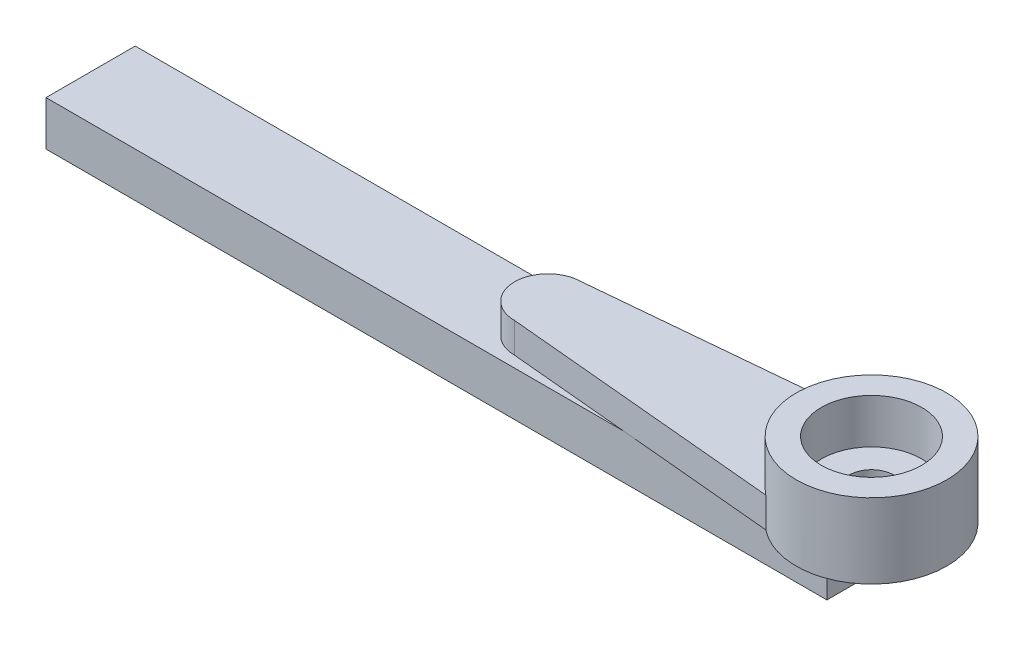
ISO-10303-21;
HEADER;
FILE_DESCRIPTION(('STEP AP214'),'2;1');
FILE_NAME('part.step','',(''),(''),'','','');
FILE_SCHEMA(('AUTOMOTIVE_DESIGN { 1 0 10303 214 1 1 1 1 }'));
ENDSEC;
DATA;
#1=APPLICATION_CONTEXT('core data for automotive mechanical design processes');
#2=APPLICATION_PROTOCOL_DEFINITION('international standard','automotive_design',2000,#1);
#3=PRODUCT_CONTEXT('',#1,'mechanical');
#4=PRODUCT('Part','Part','',(#3));
#5=PRODUCT_RELATED_PRODUCT_CATEGORY('part','',(#4));
#6=PRODUCT_DEFINITION_FORMATION('','',#4);
#7=PRODUCT_DEFINITION_CONTEXT('part definition',#1,'design');
#8=PRODUCT_DEFINITION('design','',#6,#7);
#9=PRODUCT_DEFINITION_SHAPE('','',#8);
#10=(LENGTH_UNIT() NAMED_UNIT(*) SI_UNIT(.MILLI.,.METRE.));
#11=(NAMED_UNIT(*) PLANE_ANGLE_UNIT() SI_UNIT($,.RADIAN.));
#12=(NAMED_UNIT(*) SI_UNIT($,.STERADIAN.) SOLID_ANGLE_UNIT());
#13=UNCERTAINTY_MEASURE_WITH_UNIT(LENGTH_MEASURE(1.E-05),#10,'distance_accuracy_value','');
#14=(GEOMETRIC_REPRESENTATION_CONTEXT(3) GLOBAL_UNCERTAINTY_ASSIGNED_CONTEXT((#13)) GLOBAL_UNIT_ASSIGNED_CONTEXT((#10,
#11,#12)) REPRESENTATION_CONTEXT('',''));
#15=CARTESIAN_POINT('',(0.,0.,0.));
#16=DIRECTION('',(0.,0.,1.));
#17=DIRECTION('',(1.,0.,0.));
#18=AXIS2_PLACEMENT_3D('',#15,#16,#17);
#19=CARTESIAN_POINT('',(0.,0.,0.));
#20=DIRECTION('',(0.,1.,0.));
#21=DIRECTION('',(0.,0.,1.));
#22=AXIS2_PLACEMENT_3D('',#19,#20,#21);
#23=PLANE('',#22);
#24=DIRECTION('',(0.,0.,1.));
#25=VECTOR('',#24,1.);
#26=CARTESIAN_POINT('',(0.,0.,-1.99999999999999));
#27=LINE('',#26,#25);
#28=CARTESIAN_POINT('',(0.,0.,-1.99999999999999));
#29=VERTEX_POINT('',#28);
#30=CARTESIAN_POINT('',(0.,0.,-1.));
#31=VERTEX_POINT('',#30);
#32=EDGE_CURVE('E57',#29,#31,#27,.T.);
#33=ORIENTED_EDGE('',*,*,#32,.F.);
#34=DIRECTION('',(1.,0.,0.));
#35=VECTOR('',#34,1.);
#36=CARTESIAN_POINT('',(0.,0.,-1.99999999999999));
#37=LINE('',#36,#35);
#38=CARTESIAN_POINT('',(-9.10435042645774,0.,-2.));
#39=VERTEX_POINT('',#38);
#40=EDGE_CURVE('E11',#39,#29,#37,.T.);
#41=ORIENTED_EDGE('',*,*,#40,.F.);
#42=DIRECTION('',(-0.995733846741475,0.,0.0922719158434676));
#43=VECTOR('',#42,1.);
#44=CARTESIAN_POINT('',(-0.26127194813818,0.,-2.81946375110068));
#45=LINE('',#44,#43);
#46=CARTESIAN_POINT('',(-2.09000598085269,0.,-2.65));
#47=VERTEX_POINT('',#46);
#48=EDGE_CURVE('E174',#47,#39,#45,.T.);
#49=ORIENTED_EDGE('',*,*,#48,.F.);
#50=CARTESIAN_POINT('',(0.,0.,0.));
#51=DIRECTION('',(0.,1.,0.));
#52=DIRECTION('',(0.,0.,1.));
#53=AXIS2_PLACEMENT_3D('',#50,#51,#52);
#54=CIRCLE('',#53,3.375);
#55=CARTESIAN_POINT('',(-2.09000598085269,0.,2.65));
#56=VERTEX_POINT('',#55);
#57=EDGE_CURVE('E168',#56,#47,#54,.T.);
#58=ORIENTED_EDGE('',*,*,#57,.F.);
#59=DIRECTION('',(-0.995733846741475,0.,-0.0922719158434676));
#60=VECTOR('',#59,1.);
#61=CARTESIAN_POINT('',(-0.26127194813818,0.,2.81946375110068));
#62=LINE('',#61,#60);
#63=CARTESIAN_POINT('',(-9.10435042645774,0.,2.));
#64=VERTEX_POINT('',#63);
#65=EDGE_CURVE('E181',#56,#64,#62,.T.);
#66=ORIENTED_EDGE('',*,*,#65,.T.);
#67=DIRECTION('',(-1.,0.,0.));
#68=VECTOR('',#67,1.);
#69=CARTESIAN_POINT('',(0.,0.,1.99999999999999));
#70=LINE('',#69,#68);
#71=CARTESIAN_POINT('',(0.,0.,1.99999999999999));
#72=VERTEX_POINT('',#71);
#73=EDGE_CURVE('E63',#72,#64,#70,.T.);
#74=ORIENTED_EDGE('',*,*,#73,.F.);
#75=CARTESIAN_POINT('',(0.,0.,1.));
#76=VERTEX_POINT('',#75);
#77=EDGE_CURVE('E48',#76,#72,#27,.T.);
#78=ORIENTED_EDGE('',*,*,#77,.F.);
#79=CARTESIAN_POINT('',(0.,0.,0.));
#80=DIRECTION('',(0.,1.,0.));
#81=DIRECTION('',(0.,0.,1.));
#82=AXIS2_PLACEMENT_3D('',#79,#80,#81);
#83=CIRCLE('',#82,1.);
#84=EDGE_CURVE('E149',#76,#31,#83,.T.);
#85=ORIENTED_EDGE('',*,*,#84,.T.);
#86=EDGE_LOOP('',(#33,#41,#49,#58,#66,#74,#78,#85));
#87=FACE_BOUND('',#86,.T.);
#88=ADVANCED_FACE('F39',(#87),#23,.F.);
#89=CARTESIAN_POINT('',(-0.26127194813818,1.35,-2.81946375110068));
#90=DIRECTION('',(0.0922719158434675,0.,0.995733846741475));
#91=DIRECTION('',(0.995733846741475,0.,-0.0922719158434676));
#92=AXIS2_PLACEMENT_3D('',#89,#90,#91);
#93=PLANE('',#92);
#94=ORIENTED_EDGE('',*,*,#48,.T.);
#95=CARTESIAN_POINT('',(-14.5,0.,-1.5));
#96=VERTEX_POINT('',#95);
#97=EDGE_CURVE('E161',#39,#96,#45,.T.);
#98=ORIENTED_EDGE('',*,*,#97,.T.);
#99=DIRECTION('',(0.,-1.,0.));
#100=VECTOR('',#99,1.);
#101=CARTESIAN_POINT('',(-14.5,1.35,-1.5));
#102=LINE('',#101,#100);
#103=CARTESIAN_POINT('',(-14.5,1.35,-1.5));
#104=VERTEX_POINT('',#103);
#105=EDGE_CURVE('E43',#104,#96,#102,.T.);
#106=ORIENTED_EDGE('',*,*,#105,.F.);
#107=DIRECTION('',(-0.995733846741475,0.,0.0922719158434676));
#108=VECTOR('',#107,1.);
#109=CARTESIAN_POINT('',(-0.26127194813818,1.35,-2.81946375110068));
#110=LINE('',#109,#108);
#111=CARTESIAN_POINT('',(-2.09000598085269,1.35,-2.65));
#112=VERTEX_POINT('',#111);
#113=EDGE_CURVE('E164',#112,#104,#110,.T.);
#114=ORIENTED_EDGE('',*,*,#113,.F.);
#115=DIRECTION('',(0.,-1.,0.));
#116=VECTOR('',#115,1.);
#117=CARTESIAN_POINT('',(-2.09000598085269,1.35,-2.65));
#118=LINE('',#117,#116);
#119=EDGE_CURVE('E173',#112,#47,#118,.T.);
#120=ORIENTED_EDGE('',*,*,#119,.T.);
#121=EDGE_LOOP('',(#94,#98,#106,#114,#120));
#122=FACE_BOUND('',#121,.T.);
#123=ADVANCED_FACE('F41',(#122),#93,.F.);
#124=CARTESIAN_POINT('',(-14.5,1.35,0.));
#125=DIRECTION('',(0.,-1.,0.));
#126=DIRECTION('',(0.,0.,-1.));
#127=AXIS2_PLACEMENT_3D('',#124,#125,#126);
#128=CYLINDRICAL_SURFACE('',#127,1.5);
#129=CARTESIAN_POINT('',(-14.5,0.,0.));
#130=DIRECTION('',(0.,1.,0.));
#131=DIRECTION('',(0.,0.,1.));
#132=AXIS2_PLACEMENT_3D('',#129,#130,#131);
#133=CIRCLE('',#132,1.5);
#134=CARTESIAN_POINT('',(-14.5,0.,1.5));
#135=VERTEX_POINT('',#134);
#136=EDGE_CURVE('E177',#96,#135,#133,.T.);
#137=ORIENTED_EDGE('',*,*,#136,.T.);
#138=DIRECTION('',(0.,-1.,0.));
#139=VECTOR('',#138,1.);
#140=CARTESIAN_POINT('',(-14.5,1.35,1.5));
#141=LINE('',#140,#139);
#142=CARTESIAN_POINT('',(-14.5,1.35,1.5));
#143=VERTEX_POINT('',#142);
#144=EDGE_CURVE('E187',#143,#135,#141,.T.);
#145=ORIENTED_EDGE('',*,*,#144,.F.);
#146=CARTESIAN_POINT('',(-14.5,1.35,0.));
#147=DIRECTION('',(0.,1.,0.));
#148=DIRECTION('',(0.,0.,1.));
#149=AXIS2_PLACEMENT_3D('',#146,#147,#148);
#150=CIRCLE('',#149,1.5);
#151=EDGE_CURVE('E167',#104,#143,#150,.T.);
#152=ORIENTED_EDGE('',*,*,#151,.F.);
#153=ORIENTED_EDGE('',*,*,#105,.T.);
#154=EDGE_LOOP('',(#137,#145,#152,#153));
#155=FACE_BOUND('',#154,.T.);
#156=ADVANCED_FACE('F214',(#155),#128,.T.);
#157=CARTESIAN_POINT('',(-0.26127194813818,1.35,2.81946375110068));
#158=DIRECTION('',(-0.0922719158434675,0.,0.995733846741475));
#159=DIRECTION('',(0.995733846741475,0.,0.0922719158434676));
#160=AXIS2_PLACEMENT_3D('',#157,#158,#159);
#161=PLANE('',#160);
#162=ORIENTED_EDGE('',*,*,#65,.F.);
#163=DIRECTION('',(0.,-1.,0.));
#164=VECTOR('',#163,1.);
#165=CARTESIAN_POINT('',(-2.09000598085269,1.35,2.65));
#166=LINE('',#165,#164);
#167=CARTESIAN_POINT('',(-2.09000598085269,1.35,2.65));
#168=VERTEX_POINT('',#167);
#169=EDGE_CURVE('E186',#168,#56,#166,.T.);
#170=ORIENTED_EDGE('',*,*,#169,.F.);
#171=DIRECTION('',(-0.995733846741475,0.,-0.0922719158434676));
#172=VECTOR('',#171,1.);
#173=CARTESIAN_POINT('',(-0.26127194813818,1.35,2.81946375110068));
#174=LINE('',#173,#172);
#175=EDGE_CURVE('E170',#168,#143,#174,.T.);
#176=ORIENTED_EDGE('',*,*,#175,.T.);
#177=ORIENTED_EDGE('',*,*,#144,.T.);
#178=EDGE_CURVE('E180',#64,#135,#62,.T.);
#179=ORIENTED_EDGE('',*,*,#178,.F.);
#180=EDGE_LOOP('',(#162,#170,#176,#177,#179));
#181=FACE_BOUND('',#180,.T.);
#182=ADVANCED_FACE('F223',(#181),#161,.T.);
#183=CARTESIAN_POINT('',(0.,1.35,0.));
#184=DIRECTION('',(0.,-1.,0.));
#185=DIRECTION('',(0.,0.,-1.));
#186=AXIS2_PLACEMENT_3D('',#183,#184,#185);
#187=CYLINDRICAL_SURFACE('',#186,3.375);
#188=ORIENTED_EDGE('',*,*,#57,.T.);
#189=ORIENTED_EDGE('',*,*,#119,.F.);
#190=CARTESIAN_POINT('',(0.,1.35,0.));
#191=DIRECTION('',(0.,1.,0.));
#192=DIRECTION('',(0.,0.,1.));
#193=AXIS2_PLACEMENT_3D('',#190,#191,#192);
#194=CIRCLE('',#193,3.375);
#195=EDGE_CURVE('E155',#112,#168,#194,.T.);
#196=ORIENTED_EDGE('',*,*,#195,.T.);
#197=ORIENTED_EDGE('',*,*,#169,.T.);
#198=EDGE_LOOP('',(#188,#189,#196,#197));
#199=FACE_BOUND('',#198,.T.);
#200=CARTESIAN_POINT('',(0.,3.35,0.));
#201=DIRECTION('',(0.,1.,0.));
#202=DIRECTION('',(0.,0.,1.));
#203=AXIS2_PLACEMENT_3D('',#200,#201,#202);
#204=CIRCLE('',#203,3.375);
#205=CARTESIAN_POINT('',(0.,3.35,3.375));
#206=VERTEX_POINT('',#205);
#207=EDGE_CURVE('E158',#206,#206,#204,.T.);
#208=ORIENTED_EDGE('',*,*,#207,.F.);
#209=EDGE_LOOP('',(#208));
#210=FACE_BOUND('',#209,.T.);
#211=ADVANCED_FACE('F220',(#199,#210),#187,.T.);
#212=CARTESIAN_POINT('',(0.,1.35,0.));
#213=DIRECTION('',(0.,1.,0.));
#214=DIRECTION('',(0.,0.,1.));
#215=AXIS2_PLACEMENT_3D('',#212,#213,#214);
#216=PLANE('',#215);
#217=ORIENTED_EDGE('',*,*,#195,.F.);
#218=ORIENTED_EDGE('',*,*,#113,.T.);
#219=ORIENTED_EDGE('',*,*,#151,.T.);
#220=ORIENTED_EDGE('',*,*,#175,.F.);
#221=EDGE_LOOP('',(#217,#218,#219,#220));
#222=FACE_BOUND('',#221,.T.);
#223=ADVANCED_FACE('F218',(#222),#216,.T.);
#224=CARTESIAN_POINT('',(0.,3.35,0.));
#225=DIRECTION('',(0.,1.,0.));
#226=DIRECTION('',(0.,0.,1.));
#227=AXIS2_PLACEMENT_3D('',#224,#225,#226);
#228=PLANE('',#227);
#229=CARTESIAN_POINT('',(0.,3.35,0.));
#230=DIRECTION('',(0.,1.,0.));
#231=DIRECTION('',(0.,0.,1.));
#232=AXIS2_PLACEMENT_3D('',#229,#230,#231);
#233=CIRCLE('',#232,2.25);
#234=CARTESIAN_POINT('',(0.,3.35,2.25));
#235=VERTEX_POINT('',#234);
#236=EDGE_CURVE('E150',#235,#235,#233,.T.);
#237=ORIENTED_EDGE('',*,*,#236,.F.);
#238=EDGE_LOOP('',(#237));
#239=FACE_BOUND('',#238,.T.);
#240=ORIENTED_EDGE('',*,*,#207,.T.);
#241=EDGE_LOOP('',(#240));
#242=FACE_BOUND('',#241,.T.);
#243=ADVANCED_FACE('F244',(#239,#242),#228,.T.);
#244=CARTESIAN_POINT('',(0.,1.35,0.));
#245=DIRECTION('',(0.,1.,0.));
#246=DIRECTION('',(0.,0.,1.));
#247=AXIS2_PLACEMENT_3D('',#244,#245,#246);
#248=CYLINDRICAL_SURFACE('',#247,2.25);
#249=CARTESIAN_POINT('',(0.,1.35,0.));
#250=DIRECTION('',(0.,1.,0.));
#251=DIRECTION('',(0.,0.,1.));
#252=AXIS2_PLACEMENT_3D('',#249,#250,#251);
#253=CIRCLE('',#252,2.25);
#254=CARTESIAN_POINT('',(0.,1.35,2.25));
#255=VERTEX_POINT('',#254);
#256=EDGE_CURVE('E152',#255,#255,#253,.T.);
#257=ORIENTED_EDGE('',*,*,#256,.F.);
#258=EDGE_LOOP('',(#257));
#259=FACE_BOUND('',#258,.T.);
#260=ORIENTED_EDGE('',*,*,#236,.T.);
#261=EDGE_LOOP('',(#260));
#262=FACE_BOUND('',#261,.T.);
#263=ADVANCED_FACE('F248',(#259,#262),#248,.F.);
#264=CARTESIAN_POINT('',(0.,1.35,0.));
#265=DIRECTION('',(0.,1.,0.));
#266=DIRECTION('',(0.,0.,1.));
#267=AXIS2_PLACEMENT_3D('',#264,#265,#266);
#268=PLANE('',#267);
#269=CARTESIAN_POINT('',(0.,1.35,0.));
#270=DIRECTION('',(0.,1.,0.));
#271=DIRECTION('',(0.,0.,1.));
#272=AXIS2_PLACEMENT_3D('',#269,#270,#271);
#273=CIRCLE('',#272,1.);
#274=CARTESIAN_POINT('',(0.,1.35,1.));
#275=VERTEX_POINT('',#274);
#276=EDGE_CURVE('E140',#275,#275,#273,.T.);
#277=ORIENTED_EDGE('',*,*,#276,.F.);
#278=EDGE_LOOP('',(#277));
#279=FACE_BOUND('',#278,.T.);
#280=ORIENTED_EDGE('',*,*,#256,.T.);
#281=EDGE_LOOP('',(#280));
#282=FACE_BOUND('',#281,.T.);
#283=ADVANCED_FACE('F253',(#279,#282),#268,.T.);
#284=CARTESIAN_POINT('',(0.,0.,0.));
#285=DIRECTION('',(0.,1.,0.));
#286=DIRECTION('',(0.,0.,1.));
#287=AXIS2_PLACEMENT_3D('',#284,#285,#286);
#288=CYLINDRICAL_SURFACE('',#287,1.);
#289=ORIENTED_EDGE('',*,*,#84,.F.);
#290=EDGE_CURVE('E143',#31,#76,#83,.T.);
#291=ORIENTED_EDGE('',*,*,#290,.F.);
#292=EDGE_LOOP('',(#289,#291));
#293=FACE_BOUND('',#292,.T.);
#294=ORIENTED_EDGE('',*,*,#276,.T.);
#295=EDGE_LOOP('',(#294));
#296=FACE_BOUND('',#295,.T.);
#297=ADVANCED_FACE('F206',(#293,#296),#288,.F.);
#298=CARTESIAN_POINT('',(0.,0.,0.));
#299=DIRECTION('',(0.,-1.,0.));
#300=DIRECTION('',(0.,0.,-1.));
#301=AXIS2_PLACEMENT_3D('',#298,#299,#300);
#302=PLANE('',#301);
#303=EDGE_CURVE('E196',#31,#76,#27,.T.);
#304=ORIENTED_EDGE('',*,*,#303,.F.);
#305=ORIENTED_EDGE('',*,*,#290,.T.);
#306=EDGE_LOOP('',(#304,#305));
#307=FACE_BOUND('',#306,.T.);
#308=ADVANCED_FACE('F203',(#307),#302,.F.);
#309=CARTESIAN_POINT('',(0.,-2.,-1.99999999999999));
#310=DIRECTION('',(-1.,0.,0.));
#311=DIRECTION('',(0.,0.,1.));
#312=AXIS2_PLACEMENT_3D('',#309,#310,#311);
#313=PLANE('',#312);
#314=ORIENTED_EDGE('',*,*,#32,.T.);
#315=ORIENTED_EDGE('',*,*,#303,.T.);
#316=ORIENTED_EDGE('',*,*,#77,.T.);
#317=DIRECTION('',(0.,1.,0.));
#318=VECTOR('',#317,1.);
#319=CARTESIAN_POINT('',(0.,-2.,1.99999999999999));
#320=LINE('',#319,#318);
#321=CARTESIAN_POINT('',(0.,-2.,1.99999999999999));
#322=VERTEX_POINT('',#321);
#323=EDGE_CURVE('E122',#322,#72,#320,.T.);
#324=ORIENTED_EDGE('',*,*,#323,.F.);
#325=DIRECTION('',(0.,0.,1.));
#326=VECTOR('',#325,1.);
#327=CARTESIAN_POINT('',(0.,-2.,-1.99999999999999));
#328=LINE('',#327,#326);
#329=CARTESIAN_POINT('',(0.,-2.,-1.99999999999999));
#330=VERTEX_POINT('',#329);
#331=EDGE_CURVE('E128',#330,#322,#328,.T.);
#332=ORIENTED_EDGE('',*,*,#331,.F.);
#333=DIRECTION('',(0.,1.,0.));
#334=VECTOR('',#333,1.);
#335=CARTESIAN_POINT('',(0.,-2.,-1.99999999999999));
#336=LINE('',#335,#334);
#337=EDGE_CURVE('E403',#330,#29,#336,.T.);
#338=ORIENTED_EDGE('',*,*,#337,.T.);
#339=EDGE_LOOP('',(#314,#315,#316,#324,#332,#338));
#340=FACE_BOUND('',#339,.T.);
#341=ADVANCED_FACE('F138',(#340),#313,.F.);
#342=CARTESIAN_POINT('',(0.,-2.,1.99999999999999));
#343=DIRECTION('',(0.,0.,-1.));
#344=DIRECTION('',(-1.,0.,0.));
#345=AXIS2_PLACEMENT_3D('',#342,#343,#344);
#346=PLANE('',#345);
#347=ORIENTED_EDGE('',*,*,#73,.T.);
#348=CARTESIAN_POINT('',(-35.,0.,2.));
#349=VERTEX_POINT('',#348);
#350=EDGE_CURVE('E199',#64,#349,#70,.T.);
#351=ORIENTED_EDGE('',*,*,#350,.T.);
#352=DIRECTION('',(0.,1.,0.));
#353=VECTOR('',#352,1.);
#354=CARTESIAN_POINT('',(-35.,-2.,2.));
#355=LINE('',#354,#353);
#356=CARTESIAN_POINT('',(-35.,-2.,2.));
#357=VERTEX_POINT('',#356);
#358=EDGE_CURVE('E124',#357,#349,#355,.T.);
#359=ORIENTED_EDGE('',*,*,#358,.F.);
#360=DIRECTION('',(-1.,0.,0.));
#361=VECTOR('',#360,1.);
#362=CARTESIAN_POINT('',(0.,-2.,1.99999999999999));
#363=LINE('',#362,#361);
#364=EDGE_CURVE('E118',#322,#357,#363,.T.);
#365=ORIENTED_EDGE('',*,*,#364,.F.);
#366=ORIENTED_EDGE('',*,*,#323,.T.);
#367=EDGE_LOOP('',(#347,#351,#359,#365,#366));
#368=FACE_BOUND('',#367,.T.);
#369=ADVANCED_FACE('F120',(#368),#346,.F.);
#370=CARTESIAN_POINT('',(-35.,-2.,-2.));
#371=DIRECTION('',(1.,0.,0.));
#372=DIRECTION('',(0.,0.,-1.));
#373=AXIS2_PLACEMENT_3D('',#370,#371,#372);
#374=PLANE('',#373);
#375=DIRECTION('',(0.,0.,-1.));
#376=VECTOR('',#375,1.);
#377=CARTESIAN_POINT('',(-35.,0.,-2.));
#378=LINE('',#377,#376);
#379=CARTESIAN_POINT('',(-35.,0.,-2.));
#380=VERTEX_POINT('',#379);
#381=EDGE_CURVE('E400',#349,#380,#378,.T.);
#382=ORIENTED_EDGE('',*,*,#381,.T.);
#383=DIRECTION('',(0.,1.,0.));
#384=VECTOR('',#383,1.);
#385=CARTESIAN_POINT('',(-35.,-2.,-2.));
#386=LINE('',#385,#384);
#387=CARTESIAN_POINT('',(-35.,-2.,-2.));
#388=VERTEX_POINT('',#387);
#389=EDGE_CURVE('E145',#388,#380,#386,.T.);
#390=ORIENTED_EDGE('',*,*,#389,.F.);
#391=DIRECTION('',(0.,0.,-1.));
#392=VECTOR('',#391,1.);
#393=CARTESIAN_POINT('',(-35.,-2.,-2.));
#394=LINE('',#393,#392);
#395=EDGE_CURVE('E127',#357,#388,#394,.T.);
#396=ORIENTED_EDGE('',*,*,#395,.F.);
#397=ORIENTED_EDGE('',*,*,#358,.T.);
#398=EDGE_LOOP('',(#382,#390,#396,#397));
#399=FACE_BOUND('',#398,.T.);
#400=ADVANCED_FACE('F268',(#399),#374,.F.);
#401=CARTESIAN_POINT('',(0.,-2.,-1.99999999999999));
#402=DIRECTION('',(0.,0.,1.));
#403=DIRECTION('',(1.,0.,0.));
#404=AXIS2_PLACEMENT_3D('',#401,#402,#403);
#405=PLANE('',#404);
#406=EDGE_CURVE('E50',#380,#39,#37,.T.);
#407=ORIENTED_EDGE('',*,*,#406,.T.);
#408=ORIENTED_EDGE('',*,*,#40,.T.);
#409=ORIENTED_EDGE('',*,*,#337,.F.);
#410=DIRECTION('',(1.,0.,0.));
#411=VECTOR('',#410,1.);
#412=CARTESIAN_POINT('',(0.,-2.,-1.99999999999999));
#413=LINE('',#412,#411);
#414=EDGE_CURVE('E133',#388,#330,#413,.T.);
#415=ORIENTED_EDGE('',*,*,#414,.F.);
#416=ORIENTED_EDGE('',*,*,#389,.T.);
#417=EDGE_LOOP('',(#407,#408,#409,#415,#416));
#418=FACE_BOUND('',#417,.T.);
#419=ADVANCED_FACE('F271',(#418),#405,.F.);
#420=CARTESIAN_POINT('',(0.,-2.,0.));
#421=DIRECTION('',(0.,-1.,0.));
#422=DIRECTION('',(0.,0.,-1.));
#423=AXIS2_PLACEMENT_3D('',#420,#421,#422);
#424=PLANE('',#423);
#425=ORIENTED_EDGE('',*,*,#331,.T.);
#426=ORIENTED_EDGE('',*,*,#364,.T.);
#427=ORIENTED_EDGE('',*,*,#395,.T.);
#428=ORIENTED_EDGE('',*,*,#414,.T.);
#429=EDGE_LOOP('',(#425,#426,#427,#428));
#430=FACE_BOUND('',#429,.T.);
#431=ADVANCED_FACE('F131',(#430),#424,.T.);
#432=ORIENTED_EDGE('',*,*,#97,.F.);
#433=ORIENTED_EDGE('',*,*,#406,.F.);
#434=ORIENTED_EDGE('',*,*,#381,.F.);
#435=ORIENTED_EDGE('',*,*,#350,.F.);
#436=ORIENTED_EDGE('',*,*,#178,.T.);
#437=ORIENTED_EDGE('',*,*,#136,.F.);
#438=EDGE_LOOP('',(#432,#433,#434,#435,#436,#437));
#439=FACE_BOUND('',#438,.T.);
#440=ADVANCED_FACE('F233',(#439),#302,.F.);
#441=CLOSED_SHELL('',(#88,#123,#156,#182,#211,#223,#243,#263,#283,#297,#308,#341,#369,#400,#419,
#431,#440));
#442=MANIFOLD_SOLID_BREP('B2',#441);
#443=ADVANCED_BREP_SHAPE_REPRESENTATION('',(#18,#442),#14);
#444=SHAPE_DEFINITION_REPRESENTATION(#9,#443);
ENDSEC;
END-ISO-10303-21;
